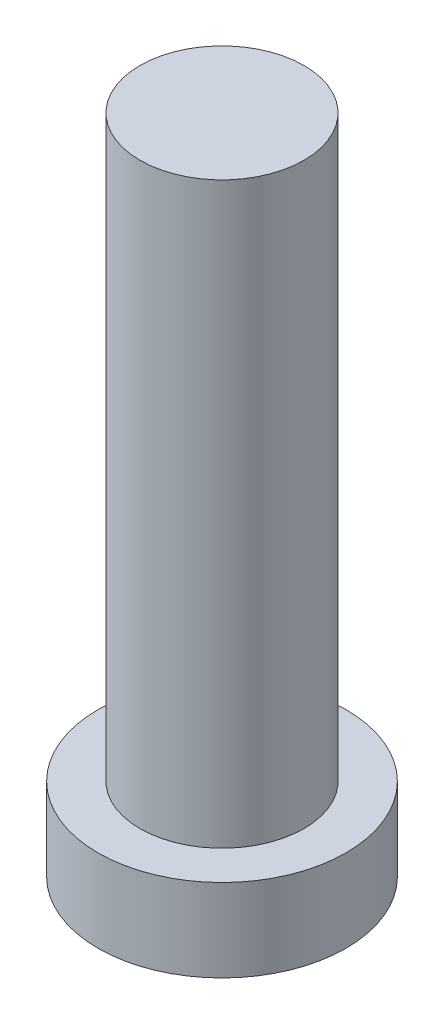
ISO-10303-21;
HEADER;
FILE_DESCRIPTION(('STEP AP214'),'2;1');
FILE_NAME('part.step','',(''),(''),'','','');
FILE_SCHEMA(('AUTOMOTIVE_DESIGN { 1 0 10303 214 1 1 1 1 }'));
ENDSEC;
DATA;
#1=APPLICATION_CONTEXT('core data for automotive mechanical design processes');
#2=APPLICATION_PROTOCOL_DEFINITION('international standard','automotive_design',2000,#1);
#3=PRODUCT_CONTEXT('',#1,'mechanical');
#4=PRODUCT('Part','Part','',(#3));
#5=PRODUCT_RELATED_PRODUCT_CATEGORY('part','',(#4));
#6=PRODUCT_DEFINITION_FORMATION('','',#4);
#7=PRODUCT_DEFINITION_CONTEXT('part definition',#1,'design');
#8=PRODUCT_DEFINITION('design','',#6,#7);
#9=PRODUCT_DEFINITION_SHAPE('','',#8);
#10=(LENGTH_UNIT() NAMED_UNIT(*) SI_UNIT(.MILLI.,.METRE.));
#11=(NAMED_UNIT(*) PLANE_ANGLE_UNIT() SI_UNIT($,.RADIAN.));
#12=(NAMED_UNIT(*) SI_UNIT($,.STERADIAN.) SOLID_ANGLE_UNIT());
#13=UNCERTAINTY_MEASURE_WITH_UNIT(LENGTH_MEASURE(1.E-05),#10,'distance_accuracy_value','');
#14=(GEOMETRIC_REPRESENTATION_CONTEXT(3) GLOBAL_UNCERTAINTY_ASSIGNED_CONTEXT((#13)) GLOBAL_UNIT_ASSIGNED_CONTEXT((#10,
#11,#12)) REPRESENTATION_CONTEXT('',''));
#15=CARTESIAN_POINT('',(0.,0.,0.));
#16=DIRECTION('',(0.,0.,1.));
#17=DIRECTION('',(1.,0.,0.));
#18=AXIS2_PLACEMENT_3D('',#15,#16,#17);
#19=CARTESIAN_POINT('',(0.,10.,0.));
#20=DIRECTION('',(0.,-1.,0.));
#21=DIRECTION('',(0.,0.,-1.));
#22=AXIS2_PLACEMENT_3D('',#19,#20,#21);
#23=CYLINDRICAL_SURFACE('',#22,15.);
#24=CARTESIAN_POINT('',(0.,10.,0.));
#25=DIRECTION('',(0.,1.,0.));
#26=DIRECTION('',(0.,0.,1.));
#27=AXIS2_PLACEMENT_3D('',#24,#25,#26);
#28=CIRCLE('',#27,15.);
#29=CARTESIAN_POINT('',(0.,10.,15.));
#30=VERTEX_POINT('',#29);
#31=EDGE_CURVE('E40',#30,#30,#28,.T.);
#32=ORIENTED_EDGE('',*,*,#31,.F.);
#33=EDGE_LOOP('',(#32));
#34=FACE_BOUND('',#33,.T.);
#35=CARTESIAN_POINT('',(0.,0.,0.));
#36=DIRECTION('',(0.,1.,0.));
#37=DIRECTION('',(0.,0.,1.));
#38=AXIS2_PLACEMENT_3D('',#35,#36,#37);
#39=CIRCLE('',#38,15.);
#40=CARTESIAN_POINT('',(0.,0.,15.));
#41=VERTEX_POINT('',#40);
#42=EDGE_CURVE('E36',#41,#41,#39,.T.);
#43=ORIENTED_EDGE('',*,*,#42,.T.);
#44=EDGE_LOOP('',(#43));
#45=FACE_BOUND('',#44,.T.);
#46=ADVANCED_FACE('F33',(#34,#45),#23,.T.);
#47=CARTESIAN_POINT('',(0.,10.,0.));
#48=DIRECTION('',(0.,1.,0.));
#49=DIRECTION('',(0.,0.,1.));
#50=AXIS2_PLACEMENT_3D('',#47,#48,#49);
#51=PLANE('',#50);
#52=CARTESIAN_POINT('',(0.,10.,0.));
#53=DIRECTION('',(0.,1.,0.));
#54=DIRECTION('',(0.,0.,1.));
#55=AXIS2_PLACEMENT_3D('',#52,#53,#54);
#56=CIRCLE('',#55,9.925);
#57=CARTESIAN_POINT('',(0.,10.,9.925));
#58=VERTEX_POINT('',#57);
#59=EDGE_CURVE('E10',#58,#58,#56,.T.);
#60=ORIENTED_EDGE('',*,*,#59,.F.);
#61=EDGE_LOOP('',(#60));
#62=FACE_BOUND('',#61,.T.);
#63=ORIENTED_EDGE('',*,*,#31,.T.);
#64=EDGE_LOOP('',(#63));
#65=FACE_BOUND('',#64,.T.);
#66=ADVANCED_FACE('F57',(#62,#65),#51,.T.);
#67=CARTESIAN_POINT('',(0.,0.,0.));
#68=DIRECTION('',(0.,1.,0.));
#69=DIRECTION('',(0.,0.,1.));
#70=AXIS2_PLACEMENT_3D('',#67,#68,#69);
#71=PLANE('',#70);
#72=ORIENTED_EDGE('',*,*,#42,.F.);
#73=EDGE_LOOP('',(#72));
#74=FACE_BOUND('',#73,.T.);
#75=ADVANCED_FACE('F54',(#74),#71,.F.);
#76=CARTESIAN_POINT('',(0.,80.,0.));
#77=DIRECTION('',(0.,-1.,0.));
#78=DIRECTION('',(0.,0.,-1.));
#79=AXIS2_PLACEMENT_3D('',#76,#77,#78);
#80=CYLINDRICAL_SURFACE('',#79,9.925);
#81=CARTESIAN_POINT('',(0.,80.,0.));
#82=DIRECTION('',(0.,1.,0.));
#83=DIRECTION('',(0.,0.,1.));
#84=AXIS2_PLACEMENT_3D('',#81,#82,#83);
#85=CIRCLE('',#84,9.925);
#86=CARTESIAN_POINT('',(0.,80.,9.925));
#87=VERTEX_POINT('',#86);
#88=EDGE_CURVE('E46',#87,#87,#85,.T.);
#89=ORIENTED_EDGE('',*,*,#88,.F.);
#90=EDGE_LOOP('',(#89));
#91=FACE_BOUND('',#90,.T.);
#92=ORIENTED_EDGE('',*,*,#59,.T.);
#93=EDGE_LOOP('',(#92));
#94=FACE_BOUND('',#93,.T.);
#95=ADVANCED_FACE('F56',(#91,#94),#80,.T.);
#96=CARTESIAN_POINT('',(0.,80.,0.));
#97=DIRECTION('',(0.,1.,0.));
#98=DIRECTION('',(0.,0.,1.));
#99=AXIS2_PLACEMENT_3D('',#96,#97,#98);
#100=PLANE('',#99);
#101=ORIENTED_EDGE('',*,*,#88,.T.);
#102=EDGE_LOOP('',(#101));
#103=FACE_BOUND('',#102,.T.);
#104=ADVANCED_FACE('F62',(#103),#100,.T.);
#105=CLOSED_SHELL('',(#46,#66,#75,#95,#104));
#106=MANIFOLD_SOLID_BREP('B2',#105);
#107=ADVANCED_BREP_SHAPE_REPRESENTATION('',(#18,#106),#14);
#108=SHAPE_DEFINITION_REPRESENTATION(#9,#107);
ENDSEC;
END-ISO-10303-21;
